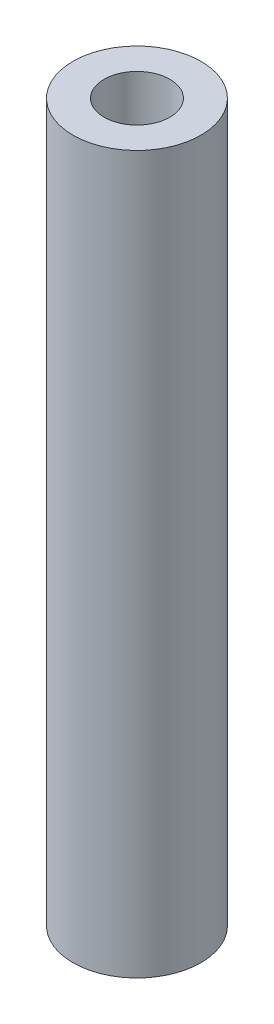
ISO-10303-21;
HEADER;
FILE_DESCRIPTION(('STEP AP214'),'2;1');
FILE_NAME('part.step','',(''),(''),'','','');
FILE_SCHEMA(('AUTOMOTIVE_DESIGN { 1 0 10303 214 1 1 1 1 }'));
ENDSEC;
DATA;
#1=APPLICATION_CONTEXT('core data for automotive mechanical design processes');
#2=APPLICATION_PROTOCOL_DEFINITION('international standard','automotive_design',2000,#1);
#3=PRODUCT_CONTEXT('',#1,'mechanical');
#4=PRODUCT('Part','Part','',(#3));
#5=PRODUCT_RELATED_PRODUCT_CATEGORY('part','',(#4));
#6=PRODUCT_DEFINITION_FORMATION('','',#4);
#7=PRODUCT_DEFINITION_CONTEXT('part definition',#1,'design');
#8=PRODUCT_DEFINITION('design','',#6,#7);
#9=PRODUCT_DEFINITION_SHAPE('','',#8);
#10=(LENGTH_UNIT() NAMED_UNIT(*) SI_UNIT(.MILLI.,.METRE.));
#11=(NAMED_UNIT(*) PLANE_ANGLE_UNIT() SI_UNIT($,.RADIAN.));
#12=(NAMED_UNIT(*) SI_UNIT($,.STERADIAN.) SOLID_ANGLE_UNIT());
#13=UNCERTAINTY_MEASURE_WITH_UNIT(LENGTH_MEASURE(1.E-05),#10,'distance_accuracy_value','');
#14=(GEOMETRIC_REPRESENTATION_CONTEXT(3) GLOBAL_UNCERTAINTY_ASSIGNED_CONTEXT((#13)) GLOBAL_UNIT_ASSIGNED_CONTEXT((#10,
#11,#12)) REPRESENTATION_CONTEXT('',''));
#15=CARTESIAN_POINT('',(0.,0.,0.));
#16=DIRECTION('',(0.,0.,1.));
#17=DIRECTION('',(1.,0.,0.));
#18=AXIS2_PLACEMENT_3D('',#15,#16,#17);
#19=CARTESIAN_POINT('',(0.,35.56,0.));
#20=DIRECTION('',(0.,-1.,0.));
#21=DIRECTION('',(0.,0.,-1.));
#22=AXIS2_PLACEMENT_3D('',#19,#20,#21);
#23=CYLINDRICAL_SURFACE('',#22,3.175);
#24=CARTESIAN_POINT('',(0.,35.56,0.));
#25=DIRECTION('',(0.,1.,0.));
#26=DIRECTION('',(0.,0.,1.));
#27=AXIS2_PLACEMENT_3D('',#24,#25,#26);
#28=CIRCLE('',#27,3.175);
#29=CARTESIAN_POINT('',(0.,35.56,3.175));
#30=VERTEX_POINT('',#29);
#31=EDGE_CURVE('E10',#30,#30,#28,.T.);
#32=ORIENTED_EDGE('',*,*,#31,.F.);
#33=EDGE_LOOP('',(#32));
#34=FACE_BOUND('',#33,.T.);
#35=CARTESIAN_POINT('',(0.,0.,0.));
#36=DIRECTION('',(0.,1.,0.));
#37=DIRECTION('',(0.,0.,1.));
#38=AXIS2_PLACEMENT_3D('',#35,#36,#37);
#39=CIRCLE('',#38,3.175);
#40=CARTESIAN_POINT('',(0.,0.,3.175));
#41=VERTEX_POINT('',#40);
#42=EDGE_CURVE('E34',#41,#41,#39,.T.);
#43=ORIENTED_EDGE('',*,*,#42,.T.);
#44=EDGE_LOOP('',(#43));
#45=FACE_BOUND('',#44,.T.);
#46=ADVANCED_FACE('F31',(#34,#45),#23,.T.);
#47=CARTESIAN_POINT('',(0.,35.56,0.));
#48=DIRECTION('',(0.,1.,0.));
#49=DIRECTION('',(0.,0.,1.));
#50=AXIS2_PLACEMENT_3D('',#47,#48,#49);
#51=PLANE('',#50);
#52=CARTESIAN_POINT('',(0.,35.56,0.));
#53=DIRECTION('',(0.,1.,0.));
#54=DIRECTION('',(0.,0.,1.));
#55=AXIS2_PLACEMENT_3D('',#52,#53,#54);
#56=CIRCLE('',#55,1.63195);
#57=CARTESIAN_POINT('',(0.,35.56,1.63195));
#58=VERTEX_POINT('',#57);
#59=EDGE_CURVE('E43',#58,#58,#56,.T.);
#60=ORIENTED_EDGE('',*,*,#59,.F.);
#61=EDGE_LOOP('',(#60));
#62=FACE_BOUND('',#61,.T.);
#63=ORIENTED_EDGE('',*,*,#31,.T.);
#64=EDGE_LOOP('',(#63));
#65=FACE_BOUND('',#64,.T.);
#66=ADVANCED_FACE('F58',(#62,#65),#51,.T.);
#67=CARTESIAN_POINT('',(0.,0.,0.));
#68=DIRECTION('',(0.,1.,0.));
#69=DIRECTION('',(0.,0.,1.));
#70=AXIS2_PLACEMENT_3D('',#67,#68,#69);
#71=PLANE('',#70);
#72=CARTESIAN_POINT('',(0.,0.,0.));
#73=DIRECTION('',(0.,1.,0.));
#74=DIRECTION('',(0.,0.,1.));
#75=AXIS2_PLACEMENT_3D('',#72,#73,#74);
#76=CIRCLE('',#75,1.63195);
#77=CARTESIAN_POINT('',(0.,0.,1.63195));
#78=VERTEX_POINT('',#77);
#79=EDGE_CURVE('E41',#78,#78,#76,.T.);
#80=ORIENTED_EDGE('',*,*,#79,.T.);
#81=EDGE_LOOP('',(#80));
#82=FACE_BOUND('',#81,.T.);
#83=ORIENTED_EDGE('',*,*,#42,.F.);
#84=EDGE_LOOP('',(#83));
#85=FACE_BOUND('',#84,.T.);
#86=ADVANCED_FACE('F49',(#82,#85),#71,.F.);
#87=CARTESIAN_POINT('',(0.,0.,0.));
#88=DIRECTION('',(0.,1.,0.));
#89=DIRECTION('',(0.,0.,1.));
#90=AXIS2_PLACEMENT_3D('',#87,#88,#89);
#91=CYLINDRICAL_SURFACE('',#90,1.63195);
#92=ORIENTED_EDGE('',*,*,#79,.F.);
#93=EDGE_LOOP('',(#92));
#94=FACE_BOUND('',#93,.T.);
#95=ORIENTED_EDGE('',*,*,#59,.T.);
#96=EDGE_LOOP('',(#95));
#97=FACE_BOUND('',#96,.T.);
#98=ADVANCED_FACE('F52',(#94,#97),#91,.F.);
#99=CLOSED_SHELL('',(#46,#66,#86,#98));
#100=MANIFOLD_SOLID_BREP('B2',#99);
#101=ADVANCED_BREP_SHAPE_REPRESENTATION('',(#18,#100),#14);
#102=SHAPE_DEFINITION_REPRESENTATION(#9,#101);
ENDSEC;
END-ISO-10303-21;
